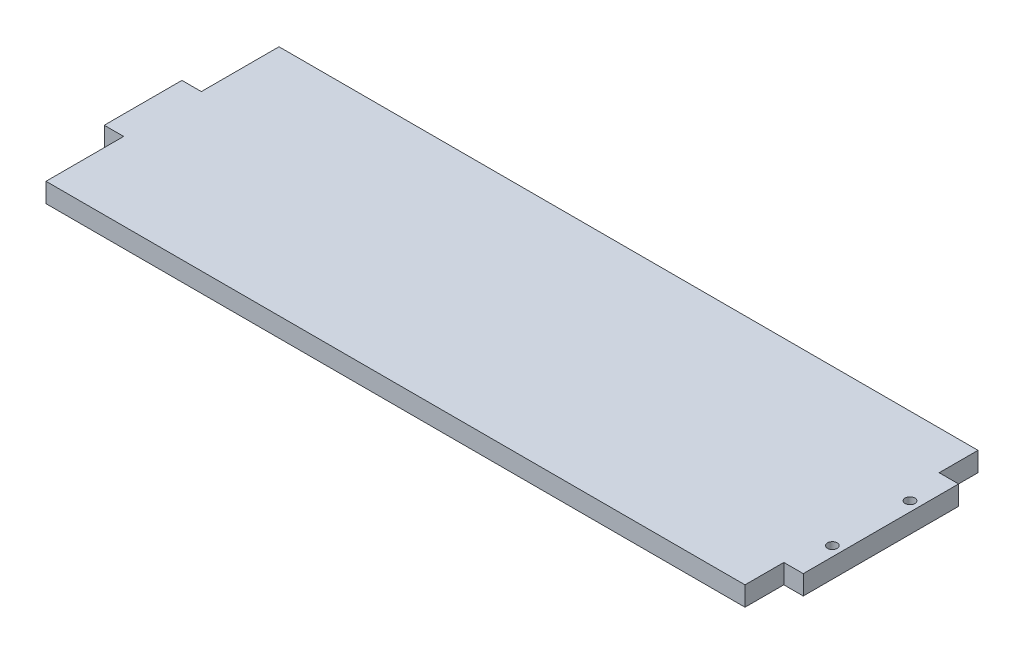
ISO-10303-21;
HEADER;
FILE_DESCRIPTION(('STEP AP214'),'2;1');
FILE_NAME('part.step','',(''),(''),'','','');
FILE_SCHEMA(('AUTOMOTIVE_DESIGN { 1 0 10303 214 1 1 1 1 }'));
ENDSEC;
DATA;
#1=APPLICATION_CONTEXT('core data for automotive mechanical design processes');
#2=APPLICATION_PROTOCOL_DEFINITION('international standard','automotive_design',2000,#1);
#3=PRODUCT_CONTEXT('',#1,'mechanical');
#4=PRODUCT('Part','Part','',(#3));
#5=PRODUCT_RELATED_PRODUCT_CATEGORY('part','',(#4));
#6=PRODUCT_DEFINITION_FORMATION('','',#4);
#7=PRODUCT_DEFINITION_CONTEXT('part definition',#1,'design');
#8=PRODUCT_DEFINITION('design','',#6,#7);
#9=PRODUCT_DEFINITION_SHAPE('','',#8);
#10=(LENGTH_UNIT() NAMED_UNIT(*) SI_UNIT(.MILLI.,.METRE.));
#11=(NAMED_UNIT(*) PLANE_ANGLE_UNIT() SI_UNIT($,.RADIAN.));
#12=(NAMED_UNIT(*) SI_UNIT($,.STERADIAN.) SOLID_ANGLE_UNIT());
#13=UNCERTAINTY_MEASURE_WITH_UNIT(LENGTH_MEASURE(1.E-05),#10,'distance_accuracy_value','');
#14=(GEOMETRIC_REPRESENTATION_CONTEXT(3) GLOBAL_UNCERTAINTY_ASSIGNED_CONTEXT((#13)) GLOBAL_UNIT_ASSIGNED_CONTEXT((#10,
#11,#12)) REPRESENTATION_CONTEXT('',''));
#15=CARTESIAN_POINT('',(0.,0.,0.));
#16=DIRECTION('',(0.,0.,1.));
#17=DIRECTION('',(1.,0.,0.));
#18=AXIS2_PLACEMENT_3D('',#15,#16,#17);
#19=CARTESIAN_POINT('',(0.,6.35,0.));
#20=DIRECTION('',(0.,-1.,0.));
#21=DIRECTION('',(0.,0.,-1.));
#22=AXIS2_PLACEMENT_3D('',#19,#20,#21);
#23=PLANE('',#22);
#24=DIRECTION('',(0.,0.,1.));
#25=VECTOR('',#24,1.);
#26=CARTESIAN_POINT('',(-75.2147753884971,6.35,28.3222892241721));
#27=LINE('',#26,#25);
#28=CARTESIAN_POINT('',(-75.2147753884971,6.35,28.3222892241721));
#29=VERTEX_POINT('',#28);
#30=CARTESIAN_POINT('',(-75.2147753884971,6.35,53.7222892241721));
#31=VERTEX_POINT('',#30);
#32=EDGE_CURVE('E177',#29,#31,#27,.T.);
#33=ORIENTED_EDGE('',*,*,#32,.T.);
#34=DIRECTION('',(-1.,0.,0.));
#35=VECTOR('',#34,1.);
#36=CARTESIAN_POINT('',(-75.2147753884971,6.35,53.7222892241721));
#37=LINE('',#36,#35);
#38=CARTESIAN_POINT('',(-81.5647753884972,6.35,53.7222892241721));
#39=VERTEX_POINT('',#38);
#40=EDGE_CURVE('E104',#31,#39,#37,.T.);
#41=ORIENTED_EDGE('',*,*,#40,.T.);
#42=DIRECTION('',(0.,0.,1.));
#43=VECTOR('',#42,1.);
#44=CARTESIAN_POINT('',(-81.5647753884972,6.35,53.7222892241721));
#45=LINE('',#44,#43);
#46=CARTESIAN_POINT('',(-81.5647753884972,6.35,79.1222892241721));
#47=VERTEX_POINT('',#46);
#48=EDGE_CURVE('E204',#39,#47,#45,.T.);
#49=ORIENTED_EDGE('',*,*,#48,.T.);
#50=DIRECTION('',(1.,0.,0.));
#51=VECTOR('',#50,1.);
#52=CARTESIAN_POINT('',(-75.2147753884971,6.35,79.1222892241721));
#53=LINE('',#52,#51);
#54=CARTESIAN_POINT('',(-75.2147753884971,6.35,79.1222892241721));
#55=VERTEX_POINT('',#54);
#56=EDGE_CURVE('E223',#47,#55,#53,.T.);
#57=ORIENTED_EDGE('',*,*,#56,.T.);
#58=DIRECTION('',(0.,0.,1.));
#59=VECTOR('',#58,1.);
#60=CARTESIAN_POINT('',(-75.2147753884971,6.35,104.522289224172));
#61=LINE('',#60,#59);
#62=CARTESIAN_POINT('',(-75.2147753884971,6.35,104.522289224172));
#63=VERTEX_POINT('',#62);
#64=EDGE_CURVE('E220',#55,#63,#61,.T.);
#65=ORIENTED_EDGE('',*,*,#64,.T.);
#66=DIRECTION('',(1.,0.,0.));
#67=VECTOR('',#66,1.);
#68=CARTESIAN_POINT('',(153.385224611503,6.35,104.522289224172));
#69=LINE('',#68,#67);
#70=CARTESIAN_POINT('',(153.385224611503,6.35,104.522289224172));
#71=VERTEX_POINT('',#70);
#72=EDGE_CURVE('E222',#63,#71,#69,.T.);
#73=ORIENTED_EDGE('',*,*,#72,.T.);
#74=DIRECTION('',(0.,0.,-1.));
#75=VECTOR('',#74,1.);
#76=CARTESIAN_POINT('',(153.385224611503,6.35,91.8222892241721));
#77=LINE('',#76,#75);
#78=CARTESIAN_POINT('',(153.385224611503,6.35,91.8222892241721));
#79=VERTEX_POINT('',#78);
#80=EDGE_CURVE('E225',#71,#79,#77,.T.);
#81=ORIENTED_EDGE('',*,*,#80,.T.);
#82=DIRECTION('',(1.,0.,0.));
#83=VECTOR('',#82,1.);
#84=CARTESIAN_POINT('',(159.735224611503,6.35,91.8222892241721));
#85=LINE('',#84,#83);
#86=CARTESIAN_POINT('',(159.735224611503,6.35,91.8222892241721));
#87=VERTEX_POINT('',#86);
#88=EDGE_CURVE('E231',#79,#87,#85,.T.);
#89=ORIENTED_EDGE('',*,*,#88,.T.);
#90=DIRECTION('',(0.,0.,-1.));
#91=VECTOR('',#90,1.);
#92=CARTESIAN_POINT('',(159.735224611503,6.35,66.4222892241721));
#93=LINE('',#92,#91);
#94=CARTESIAN_POINT('',(159.735224611503,6.35,41.0222892241721));
#95=VERTEX_POINT('',#94);
#96=EDGE_CURVE('E135',#87,#95,#93,.T.);
#97=ORIENTED_EDGE('',*,*,#96,.T.);
#98=DIRECTION('',(-1.,0.,0.));
#99=VECTOR('',#98,1.);
#100=CARTESIAN_POINT('',(159.735224611503,6.35,41.0222892241721));
#101=LINE('',#100,#99);
#102=CARTESIAN_POINT('',(153.385224611503,6.35,41.0222892241721));
#103=VERTEX_POINT('',#102);
#104=EDGE_CURVE('E129',#95,#103,#101,.T.);
#105=ORIENTED_EDGE('',*,*,#104,.T.);
#106=DIRECTION('',(0.,0.,-1.));
#107=VECTOR('',#106,1.);
#108=CARTESIAN_POINT('',(153.385224611503,6.35,28.3222892241721));
#109=LINE('',#108,#107);
#110=CARTESIAN_POINT('',(153.385224611503,6.35,28.3222892241721));
#111=VERTEX_POINT('',#110);
#112=EDGE_CURVE('E133',#103,#111,#109,.T.);
#113=ORIENTED_EDGE('',*,*,#112,.T.);
#114=DIRECTION('',(-1.,0.,0.));
#115=VECTOR('',#114,1.);
#116=CARTESIAN_POINT('',(-75.2147753884971,6.35,28.3222892241721));
#117=LINE('',#116,#115);
#118=EDGE_CURVE('E49',#111,#29,#117,.T.);
#119=ORIENTED_EDGE('',*,*,#118,.T.);
#120=EDGE_LOOP('',(#33,#41,#49,#57,#65,#73,#81,#89,#97,#105,#113,#119));
#121=FACE_BOUND('',#120,.T.);
#122=CARTESIAN_POINT('',(156.560224611503,6.35,53.7222892241721));
#123=DIRECTION('',(0.,1.,0.));
#124=DIRECTION('',(0.,0.,1.));
#125=AXIS2_PLACEMENT_3D('',#122,#123,#124);
#126=CIRCLE('',#125,1.58750000000007);
#127=CARTESIAN_POINT('',(156.560224611503,6.35,55.3097892241721));
#128=VERTEX_POINT('',#127);
#129=EDGE_CURVE('E157',#128,#128,#126,.T.);
#130=ORIENTED_EDGE('',*,*,#129,.F.);
#131=EDGE_LOOP('',(#130));
#132=FACE_BOUND('',#131,.T.);
#133=CARTESIAN_POINT('',(156.560224611503,6.35,79.1222892241721));
#134=DIRECTION('',(0.,1.,0.));
#135=DIRECTION('',(0.,0.,1.));
#136=AXIS2_PLACEMENT_3D('',#133,#134,#135);
#137=CIRCLE('',#136,1.58750000000007);
#138=CARTESIAN_POINT('',(156.560224611503,6.35,80.7097892241722));
#139=VERTEX_POINT('',#138);
#140=EDGE_CURVE('E271',#139,#139,#137,.T.);
#141=ORIENTED_EDGE('',*,*,#140,.F.);
#142=EDGE_LOOP('',(#141));
#143=FACE_BOUND('',#142,.T.);
#144=ADVANCED_FACE('F32',(#121,#132,#143),#23,.F.);
#145=CARTESIAN_POINT('',(0.,0.,0.));
#146=DIRECTION('',(0.,-1.,0.));
#147=DIRECTION('',(0.,0.,-1.));
#148=AXIS2_PLACEMENT_3D('',#145,#146,#147);
#149=PLANE('',#148);
#150=CARTESIAN_POINT('',(156.560224611503,0.,53.7222892241721));
#151=DIRECTION('',(0.,1.,0.));
#152=DIRECTION('',(0.,0.,1.));
#153=AXIS2_PLACEMENT_3D('',#150,#151,#152);
#154=CIRCLE('',#153,1.58750000000007);
#155=CARTESIAN_POINT('',(156.560224611503,0.,55.3097892241721));
#156=VERTEX_POINT('',#155);
#157=EDGE_CURVE('E276',#156,#156,#154,.T.);
#158=ORIENTED_EDGE('',*,*,#157,.T.);
#159=EDGE_LOOP('',(#158));
#160=FACE_BOUND('',#159,.T.);
#161=DIRECTION('',(0.,0.,1.));
#162=VECTOR('',#161,1.);
#163=CARTESIAN_POINT('',(-75.2147753884971,0.,28.3222892241721));
#164=LINE('',#163,#162);
#165=CARTESIAN_POINT('',(-75.2147753884971,0.,28.3222892241721));
#166=VERTEX_POINT('',#165);
#167=CARTESIAN_POINT('',(-75.2147753884971,0.,53.7222892241721));
#168=VERTEX_POINT('',#167);
#169=EDGE_CURVE('E153',#166,#168,#164,.T.);
#170=ORIENTED_EDGE('',*,*,#169,.F.);
#171=DIRECTION('',(-1.,0.,0.));
#172=VECTOR('',#171,1.);
#173=CARTESIAN_POINT('',(-75.2147753884971,0.,28.3222892241721));
#174=LINE('',#173,#172);
#175=CARTESIAN_POINT('',(153.385224611503,0.,28.3222892241721));
#176=VERTEX_POINT('',#175);
#177=EDGE_CURVE('E96',#176,#166,#174,.T.);
#178=ORIENTED_EDGE('',*,*,#177,.F.);
#179=DIRECTION('',(0.,0.,-1.));
#180=VECTOR('',#179,1.);
#181=CARTESIAN_POINT('',(153.385224611503,0.,28.3222892241721));
#182=LINE('',#181,#180);
#183=CARTESIAN_POINT('',(153.385224611503,0.,41.0222892241721));
#184=VERTEX_POINT('',#183);
#185=EDGE_CURVE('E90',#184,#176,#182,.T.);
#186=ORIENTED_EDGE('',*,*,#185,.F.);
#187=DIRECTION('',(-1.,0.,0.));
#188=VECTOR('',#187,1.);
#189=CARTESIAN_POINT('',(159.735224611503,0.,41.0222892241721));
#190=LINE('',#189,#188);
#191=CARTESIAN_POINT('',(159.735224611503,0.,41.0222892241721));
#192=VERTEX_POINT('',#191);
#193=EDGE_CURVE('E143',#192,#184,#190,.T.);
#194=ORIENTED_EDGE('',*,*,#193,.F.);
#195=DIRECTION('',(0.,0.,-1.));
#196=VECTOR('',#195,1.);
#197=CARTESIAN_POINT('',(159.735224611503,0.,66.4222892241721));
#198=LINE('',#197,#196);
#199=CARTESIAN_POINT('',(159.735224611503,0.,91.8222892241721));
#200=VERTEX_POINT('',#199);
#201=EDGE_CURVE('E172',#200,#192,#198,.T.);
#202=ORIENTED_EDGE('',*,*,#201,.F.);
#203=DIRECTION('',(1.,0.,0.));
#204=VECTOR('',#203,1.);
#205=CARTESIAN_POINT('',(159.735224611503,0.,91.8222892241721));
#206=LINE('',#205,#204);
#207=CARTESIAN_POINT('',(153.385224611503,0.,91.8222892241721));
#208=VERTEX_POINT('',#207);
#209=EDGE_CURVE('E169',#208,#200,#206,.T.);
#210=ORIENTED_EDGE('',*,*,#209,.F.);
#211=DIRECTION('',(0.,0.,-1.));
#212=VECTOR('',#211,1.);
#213=CARTESIAN_POINT('',(153.385224611503,0.,91.8222892241721));
#214=LINE('',#213,#212);
#215=CARTESIAN_POINT('',(153.385224611503,0.,104.522289224172));
#216=VERTEX_POINT('',#215);
#217=EDGE_CURVE('E167',#216,#208,#214,.T.);
#218=ORIENTED_EDGE('',*,*,#217,.F.);
#219=DIRECTION('',(1.,0.,0.));
#220=VECTOR('',#219,1.);
#221=CARTESIAN_POINT('',(153.385224611503,0.,104.522289224172));
#222=LINE('',#221,#220);
#223=CARTESIAN_POINT('',(-75.2147753884971,0.,104.522289224172));
#224=VERTEX_POINT('',#223);
#225=EDGE_CURVE('E165',#224,#216,#222,.T.);
#226=ORIENTED_EDGE('',*,*,#225,.F.);
#227=DIRECTION('',(0.,0.,1.));
#228=VECTOR('',#227,1.);
#229=CARTESIAN_POINT('',(-75.2147753884971,0.,104.522289224172));
#230=LINE('',#229,#228);
#231=CARTESIAN_POINT('',(-75.2147753884971,0.,79.1222892241721));
#232=VERTEX_POINT('',#231);
#233=EDGE_CURVE('E163',#232,#224,#230,.T.);
#234=ORIENTED_EDGE('',*,*,#233,.F.);
#235=DIRECTION('',(1.,0.,0.));
#236=VECTOR('',#235,1.);
#237=CARTESIAN_POINT('',(-75.2147753884971,0.,79.1222892241721));
#238=LINE('',#237,#236);
#239=CARTESIAN_POINT('',(-81.5647753884972,0.,79.1222892241721));
#240=VERTEX_POINT('',#239);
#241=EDGE_CURVE('E161',#240,#232,#238,.T.);
#242=ORIENTED_EDGE('',*,*,#241,.F.);
#243=DIRECTION('',(0.,0.,1.));
#244=VECTOR('',#243,1.);
#245=CARTESIAN_POINT('',(-81.5647753884972,0.,53.7222892241721));
#246=LINE('',#245,#244);
#247=CARTESIAN_POINT('',(-81.5647753884972,0.,53.7222892241721));
#248=VERTEX_POINT('',#247);
#249=EDGE_CURVE('E159',#248,#240,#246,.T.);
#250=ORIENTED_EDGE('',*,*,#249,.F.);
#251=DIRECTION('',(-1.,0.,0.));
#252=VECTOR('',#251,1.);
#253=CARTESIAN_POINT('',(-75.2147753884971,0.,53.7222892241721));
#254=LINE('',#253,#252);
#255=EDGE_CURVE('E156',#168,#248,#254,.T.);
#256=ORIENTED_EDGE('',*,*,#255,.F.);
#257=EDGE_LOOP('',(#170,#178,#186,#194,#202,#210,#218,#226,#234,#242,#250,#256));
#258=FACE_BOUND('',#257,.T.);
#259=CARTESIAN_POINT('',(156.560224611503,0.,79.1222892241721));
#260=DIRECTION('',(0.,1.,0.));
#261=DIRECTION('',(0.,0.,1.));
#262=AXIS2_PLACEMENT_3D('',#259,#260,#261);
#263=CIRCLE('',#262,1.58750000000007);
#264=CARTESIAN_POINT('',(156.560224611503,0.,80.7097892241722));
#265=VERTEX_POINT('',#264);
#266=EDGE_CURVE('E274',#265,#265,#263,.T.);
#267=ORIENTED_EDGE('',*,*,#266,.T.);
#268=EDGE_LOOP('',(#267));
#269=FACE_BOUND('',#268,.T.);
#270=ADVANCED_FACE('F208',(#160,#258,#269),#149,.T.);
#271=CARTESIAN_POINT('',(-75.2147753884971,6.35,28.3222892241721));
#272=DIRECTION('',(1.,0.,0.));
#273=DIRECTION('',(0.,0.,-1.));
#274=AXIS2_PLACEMENT_3D('',#271,#272,#273);
#275=PLANE('',#274);
#276=ORIENTED_EDGE('',*,*,#169,.T.);
#277=DIRECTION('',(0.,-1.,0.));
#278=VECTOR('',#277,1.);
#279=CARTESIAN_POINT('',(-75.2147753884971,6.35,53.7222892241721));
#280=LINE('',#279,#278);
#281=EDGE_CURVE('E11',#31,#168,#280,.T.);
#282=ORIENTED_EDGE('',*,*,#281,.F.);
#283=ORIENTED_EDGE('',*,*,#32,.F.);
#284=DIRECTION('',(0.,-1.,0.));
#285=VECTOR('',#284,1.);
#286=CARTESIAN_POINT('',(-75.2147753884971,6.35,28.3222892241721));
#287=LINE('',#286,#285);
#288=EDGE_CURVE('E149',#29,#166,#287,.T.);
#289=ORIENTED_EDGE('',*,*,#288,.T.);
#290=EDGE_LOOP('',(#276,#282,#283,#289));
#291=FACE_BOUND('',#290,.T.);
#292=ADVANCED_FACE('F34',(#291),#275,.F.);
#293=CARTESIAN_POINT('',(-75.2147753884971,6.35,53.7222892241721));
#294=DIRECTION('',(0.,0.,1.));
#295=DIRECTION('',(1.,0.,0.));
#296=AXIS2_PLACEMENT_3D('',#293,#294,#295);
#297=PLANE('',#296);
#298=ORIENTED_EDGE('',*,*,#255,.T.);
#299=DIRECTION('',(0.,-1.,0.));
#300=VECTOR('',#299,1.);
#301=CARTESIAN_POINT('',(-81.5647753884972,6.35,53.7222892241721));
#302=LINE('',#301,#300);
#303=EDGE_CURVE('E41',#39,#248,#302,.T.);
#304=ORIENTED_EDGE('',*,*,#303,.F.);
#305=ORIENTED_EDGE('',*,*,#40,.F.);
#306=ORIENTED_EDGE('',*,*,#281,.T.);
#307=EDGE_LOOP('',(#298,#304,#305,#306));
#308=FACE_BOUND('',#307,.T.);
#309=ADVANCED_FACE('F372',(#308),#297,.F.);
#310=CARTESIAN_POINT('',(-81.5647753884972,6.35,53.7222892241721));
#311=DIRECTION('',(1.,0.,0.));
#312=DIRECTION('',(0.,0.,-1.));
#313=AXIS2_PLACEMENT_3D('',#310,#311,#312);
#314=PLANE('',#313);
#315=ORIENTED_EDGE('',*,*,#249,.T.);
#316=DIRECTION('',(0.,-1.,0.));
#317=VECTOR('',#316,1.);
#318=CARTESIAN_POINT('',(-81.5647753884972,6.35,79.1222892241721));
#319=LINE('',#318,#317);
#320=EDGE_CURVE('E196',#47,#240,#319,.T.);
#321=ORIENTED_EDGE('',*,*,#320,.F.);
#322=ORIENTED_EDGE('',*,*,#48,.F.);
#323=ORIENTED_EDGE('',*,*,#303,.T.);
#324=EDGE_LOOP('',(#315,#321,#322,#323));
#325=FACE_BOUND('',#324,.T.);
#326=ADVANCED_FACE('F202',(#325),#314,.F.);
#327=CARTESIAN_POINT('',(-75.2147753884971,6.35,79.1222892241721));
#328=DIRECTION('',(0.,0.,-1.));
#329=DIRECTION('',(-1.,0.,0.));
#330=AXIS2_PLACEMENT_3D('',#327,#328,#329);
#331=PLANE('',#330);
#332=ORIENTED_EDGE('',*,*,#241,.T.);
#333=DIRECTION('',(0.,-1.,0.));
#334=VECTOR('',#333,1.);
#335=CARTESIAN_POINT('',(-75.2147753884971,6.35,79.1222892241721));
#336=LINE('',#335,#334);
#337=EDGE_CURVE('E193',#55,#232,#336,.T.);
#338=ORIENTED_EDGE('',*,*,#337,.F.);
#339=ORIENTED_EDGE('',*,*,#56,.F.);
#340=ORIENTED_EDGE('',*,*,#320,.T.);
#341=EDGE_LOOP('',(#332,#338,#339,#340));
#342=FACE_BOUND('',#341,.T.);
#343=ADVANCED_FACE('F214',(#342),#331,.F.);
#344=CARTESIAN_POINT('',(-75.2147753884971,6.35,104.522289224172));
#345=DIRECTION('',(1.,0.,0.));
#346=DIRECTION('',(0.,0.,-1.));
#347=AXIS2_PLACEMENT_3D('',#344,#345,#346);
#348=PLANE('',#347);
#349=ORIENTED_EDGE('',*,*,#233,.T.);
#350=DIRECTION('',(0.,-1.,0.));
#351=VECTOR('',#350,1.);
#352=CARTESIAN_POINT('',(-75.2147753884971,6.35,104.522289224172));
#353=LINE('',#352,#351);
#354=EDGE_CURVE('E190',#63,#224,#353,.T.);
#355=ORIENTED_EDGE('',*,*,#354,.F.);
#356=ORIENTED_EDGE('',*,*,#64,.F.);
#357=ORIENTED_EDGE('',*,*,#337,.T.);
#358=EDGE_LOOP('',(#349,#355,#356,#357));
#359=FACE_BOUND('',#358,.T.);
#360=ADVANCED_FACE('F218',(#359),#348,.F.);
#361=CARTESIAN_POINT('',(153.385224611503,6.35,104.522289224172));
#362=DIRECTION('',(0.,0.,-1.));
#363=DIRECTION('',(-1.,0.,0.));
#364=AXIS2_PLACEMENT_3D('',#361,#362,#363);
#365=PLANE('',#364);
#366=ORIENTED_EDGE('',*,*,#225,.T.);
#367=DIRECTION('',(0.,-1.,0.));
#368=VECTOR('',#367,1.);
#369=CARTESIAN_POINT('',(153.385224611503,6.35,104.522289224172));
#370=LINE('',#369,#368);
#371=EDGE_CURVE('E187',#71,#216,#370,.T.);
#372=ORIENTED_EDGE('',*,*,#371,.F.);
#373=ORIENTED_EDGE('',*,*,#72,.F.);
#374=ORIENTED_EDGE('',*,*,#354,.T.);
#375=EDGE_LOOP('',(#366,#372,#373,#374));
#376=FACE_BOUND('',#375,.T.);
#377=ADVANCED_FACE('F337',(#376),#365,.F.);
#378=CARTESIAN_POINT('',(153.385224611503,6.35,91.8222892241721));
#379=DIRECTION('',(-1.,0.,0.));
#380=DIRECTION('',(0.,0.,1.));
#381=AXIS2_PLACEMENT_3D('',#378,#379,#380);
#382=PLANE('',#381);
#383=ORIENTED_EDGE('',*,*,#217,.T.);
#384=DIRECTION('',(0.,-1.,0.));
#385=VECTOR('',#384,1.);
#386=CARTESIAN_POINT('',(153.385224611503,6.35,91.8222892241721));
#387=LINE('',#386,#385);
#388=EDGE_CURVE('E184',#79,#208,#387,.T.);
#389=ORIENTED_EDGE('',*,*,#388,.F.);
#390=ORIENTED_EDGE('',*,*,#80,.F.);
#391=ORIENTED_EDGE('',*,*,#371,.T.);
#392=EDGE_LOOP('',(#383,#389,#390,#391));
#393=FACE_BOUND('',#392,.T.);
#394=ADVANCED_FACE('F328',(#393),#382,.F.);
#395=CARTESIAN_POINT('',(159.735224611503,6.35,91.8222892241721));
#396=DIRECTION('',(0.,0.,-1.));
#397=DIRECTION('',(-1.,0.,0.));
#398=AXIS2_PLACEMENT_3D('',#395,#396,#397);
#399=PLANE('',#398);
#400=ORIENTED_EDGE('',*,*,#209,.T.);
#401=DIRECTION('',(0.,-1.,0.));
#402=VECTOR('',#401,1.);
#403=CARTESIAN_POINT('',(159.735224611503,6.35,91.8222892241721));
#404=LINE('',#403,#402);
#405=EDGE_CURVE('E181',#87,#200,#404,.T.);
#406=ORIENTED_EDGE('',*,*,#405,.F.);
#407=ORIENTED_EDGE('',*,*,#88,.F.);
#408=ORIENTED_EDGE('',*,*,#388,.T.);
#409=EDGE_LOOP('',(#400,#406,#407,#408));
#410=FACE_BOUND('',#409,.T.);
#411=ADVANCED_FACE('F237',(#410),#399,.F.);
#412=CARTESIAN_POINT('',(159.735224611503,6.35,66.4222892241721));
#413=DIRECTION('',(-1.,0.,0.));
#414=DIRECTION('',(0.,0.,1.));
#415=AXIS2_PLACEMENT_3D('',#412,#413,#414);
#416=PLANE('',#415);
#417=ORIENTED_EDGE('',*,*,#201,.T.);
#418=DIRECTION('',(0.,-1.,0.));
#419=VECTOR('',#418,1.);
#420=CARTESIAN_POINT('',(159.735224611503,6.35,41.0222892241721));
#421=LINE('',#420,#419);
#422=EDGE_CURVE('E144',#95,#192,#421,.T.);
#423=ORIENTED_EDGE('',*,*,#422,.F.);
#424=ORIENTED_EDGE('',*,*,#96,.F.);
#425=ORIENTED_EDGE('',*,*,#405,.T.);
#426=EDGE_LOOP('',(#417,#423,#424,#425));
#427=FACE_BOUND('',#426,.T.);
#428=ADVANCED_FACE('F240',(#427),#416,.F.);
#429=CARTESIAN_POINT('',(159.735224611503,6.35,41.0222892241721));
#430=DIRECTION('',(0.,0.,1.));
#431=DIRECTION('',(1.,0.,0.));
#432=AXIS2_PLACEMENT_3D('',#429,#430,#431);
#433=PLANE('',#432);
#434=ORIENTED_EDGE('',*,*,#193,.T.);
#435=DIRECTION('',(0.,-1.,0.));
#436=VECTOR('',#435,1.);
#437=CARTESIAN_POINT('',(153.385224611503,6.35,41.0222892241721));
#438=LINE('',#437,#436);
#439=EDGE_CURVE('E140',#103,#184,#438,.T.);
#440=ORIENTED_EDGE('',*,*,#439,.F.);
#441=ORIENTED_EDGE('',*,*,#104,.F.);
#442=ORIENTED_EDGE('',*,*,#422,.T.);
#443=EDGE_LOOP('',(#434,#440,#441,#442));
#444=FACE_BOUND('',#443,.T.);
#445=ADVANCED_FACE('F141',(#444),#433,.F.);
#446=CARTESIAN_POINT('',(153.385224611503,6.35,28.3222892241721));
#447=DIRECTION('',(-1.,0.,0.));
#448=DIRECTION('',(0.,0.,1.));
#449=AXIS2_PLACEMENT_3D('',#446,#447,#448);
#450=PLANE('',#449);
#451=ORIENTED_EDGE('',*,*,#185,.T.);
#452=DIRECTION('',(0.,-1.,0.));
#453=VECTOR('',#452,1.);
#454=CARTESIAN_POINT('',(153.385224611503,6.35,28.3222892241721));
#455=LINE('',#454,#453);
#456=EDGE_CURVE('E145',#111,#176,#455,.T.);
#457=ORIENTED_EDGE('',*,*,#456,.F.);
#458=ORIENTED_EDGE('',*,*,#112,.F.);
#459=ORIENTED_EDGE('',*,*,#439,.T.);
#460=EDGE_LOOP('',(#451,#457,#458,#459));
#461=FACE_BOUND('',#460,.T.);
#462=ADVANCED_FACE('F147',(#461),#450,.F.);
#463=CARTESIAN_POINT('',(-75.2147753884971,6.35,28.3222892241721));
#464=DIRECTION('',(0.,0.,1.));
#465=DIRECTION('',(1.,0.,0.));
#466=AXIS2_PLACEMENT_3D('',#463,#464,#465);
#467=PLANE('',#466);
#468=ORIENTED_EDGE('',*,*,#177,.T.);
#469=ORIENTED_EDGE('',*,*,#288,.F.);
#470=ORIENTED_EDGE('',*,*,#118,.F.);
#471=ORIENTED_EDGE('',*,*,#456,.T.);
#472=EDGE_LOOP('',(#468,#469,#470,#471));
#473=FACE_BOUND('',#472,.T.);
#474=ADVANCED_FACE('F244',(#473),#467,.F.);
#475=CARTESIAN_POINT('',(156.560224611503,6.35,53.7222892241721));
#476=DIRECTION('',(0.,-1.,0.));
#477=DIRECTION('',(0.,0.,-1.));
#478=AXIS2_PLACEMENT_3D('',#475,#476,#477);
#479=CYLINDRICAL_SURFACE('',#478,1.58750000000007);
#480=ORIENTED_EDGE('',*,*,#129,.T.);
#481=EDGE_LOOP('',(#480));
#482=FACE_BOUND('',#481,.T.);
#483=ORIENTED_EDGE('',*,*,#157,.F.);
#484=EDGE_LOOP('',(#483));
#485=FACE_BOUND('',#484,.T.);
#486=ADVANCED_FACE('F246',(#482,#485),#479,.F.);
#487=CARTESIAN_POINT('',(156.560224611503,6.35,79.1222892241721));
#488=DIRECTION('',(0.,-1.,0.));
#489=DIRECTION('',(0.,0.,-1.));
#490=AXIS2_PLACEMENT_3D('',#487,#488,#489);
#491=CYLINDRICAL_SURFACE('',#490,1.58750000000007);
#492=ORIENTED_EDGE('',*,*,#140,.T.);
#493=EDGE_LOOP('',(#492));
#494=FACE_BOUND('',#493,.T.);
#495=ORIENTED_EDGE('',*,*,#266,.F.);
#496=EDGE_LOOP('',(#495));
#497=FACE_BOUND('',#496,.T.);
#498=ADVANCED_FACE('F252',(#494,#497),#491,.F.);
#499=CLOSED_SHELL('',(#144,#270,#292,#309,#326,#343,#360,#377,#394,#411,#428,#445,#462,#474,
#486,#498));
#500=MANIFOLD_SOLID_BREP('B2',#499);
#501=ADVANCED_BREP_SHAPE_REPRESENTATION('',(#18,#500),#14);
#502=SHAPE_DEFINITION_REPRESENTATION(#9,#501);
ENDSEC;
END-ISO-10303-21;
